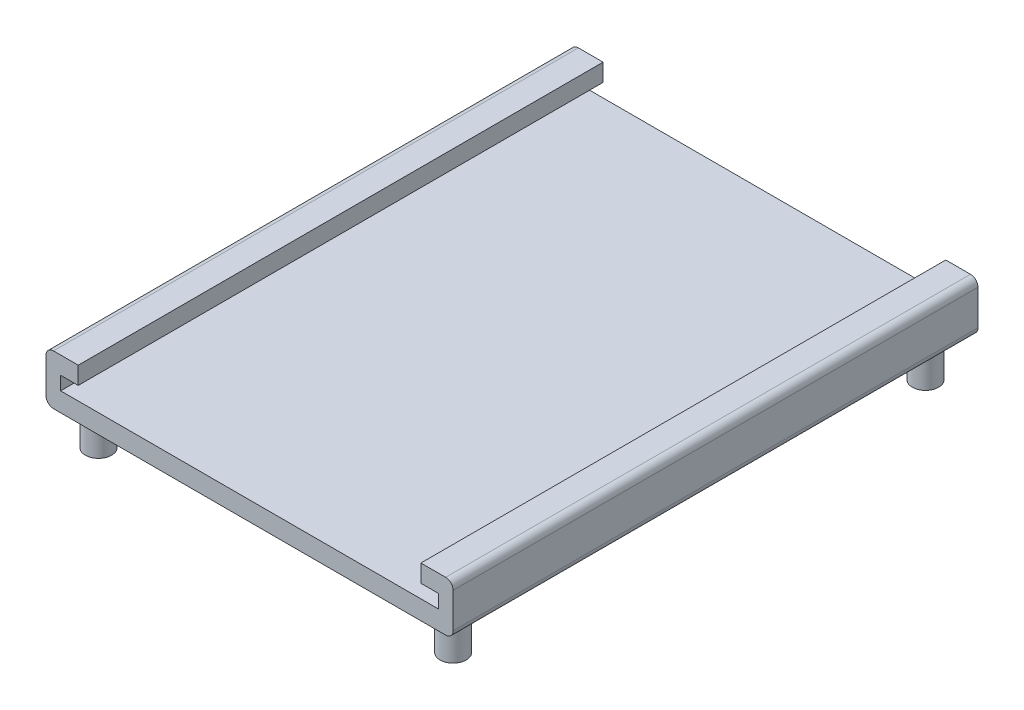
ISO-10303-21;
HEADER;
FILE_DESCRIPTION(('STEP AP214'),'2;1');
FILE_NAME('part.step','',(''),(''),'','','');
FILE_SCHEMA(('AUTOMOTIVE_DESIGN { 1 0 10303 214 1 1 1 1 }'));
ENDSEC;
DATA;
#1=APPLICATION_CONTEXT('core data for automotive mechanical design processes');
#2=APPLICATION_PROTOCOL_DEFINITION('international standard','automotive_design',2000,#1);
#3=PRODUCT_CONTEXT('',#1,'mechanical');
#4=PRODUCT('Part','Part','',(#3));
#5=PRODUCT_RELATED_PRODUCT_CATEGORY('part','',(#4));
#6=PRODUCT_DEFINITION_FORMATION('','',#4);
#7=PRODUCT_DEFINITION_CONTEXT('part definition',#1,'design');
#8=PRODUCT_DEFINITION('design','',#6,#7);
#9=PRODUCT_DEFINITION_SHAPE('','',#8);
#10=(LENGTH_UNIT() NAMED_UNIT(*) SI_UNIT(.MILLI.,.METRE.));
#11=(NAMED_UNIT(*) PLANE_ANGLE_UNIT() SI_UNIT($,.RADIAN.));
#12=(NAMED_UNIT(*) SI_UNIT($,.STERADIAN.) SOLID_ANGLE_UNIT());
#13=UNCERTAINTY_MEASURE_WITH_UNIT(LENGTH_MEASURE(1.E-05),#10,'distance_accuracy_value','');
#14=(GEOMETRIC_REPRESENTATION_CONTEXT(3) GLOBAL_UNCERTAINTY_ASSIGNED_CONTEXT((#13)) GLOBAL_UNIT_ASSIGNED_CONTEXT((#10,
#11,#12)) REPRESENTATION_CONTEXT('',''));
#15=CARTESIAN_POINT('',(0.,0.,0.));
#16=DIRECTION('',(0.,0.,1.));
#17=DIRECTION('',(1.,0.,0.));
#18=AXIS2_PLACEMENT_3D('',#15,#16,#17);
#19=CARTESIAN_POINT('',(700.180956215145,865.595910234927,1266.5722605881));
#20=DIRECTION('',(0.,0.,1.));
#21=DIRECTION('',(0.,-1.,0.));
#22=AXIS2_PLACEMENT_3D('',#19,#20,#21);
#23=PLANE('',#22);
#24=DIRECTION('',(0.,1.,0.));
#25=VECTOR('',#24,1.);
#26=CARTESIAN_POINT('',(648.030956215145,865.595910234927,1266.5722605881));
#27=LINE('',#26,#25);
#28=CARTESIAN_POINT('',(648.030956215145,866.595910234927,1266.5722605881));
#29=VERTEX_POINT('',#28);
#30=CARTESIAN_POINT('',(648.030956215145,871.275910234927,1266.5722605881));
#31=VERTEX_POINT('',#30);
#32=EDGE_CURVE('E221',#29,#31,#27,.T.);
#33=ORIENTED_EDGE('',*,*,#32,.T.);
#34=CARTESIAN_POINT('',(649.030956215145,871.275910234927,1266.5722605881));
#35=DIRECTION('',(0.,0.,1.));
#36=DIRECTION('',(0.,-1.,0.));
#37=AXIS2_PLACEMENT_3D('',#34,#35,#36);
#38=CIRCLE('',#37,1.);
#39=CARTESIAN_POINT('',(649.030956215145,872.275910234927,1266.5722605881));
#40=VERTEX_POINT('',#39);
#41=EDGE_CURVE('E289',#31,#40,#38,.F.);
#42=ORIENTED_EDGE('',*,*,#41,.T.);
#43=DIRECTION('',(1.,0.,0.));
#44=VECTOR('',#43,1.);
#45=CARTESIAN_POINT('',(650.180956215145,872.275910234927,1266.5722605881));
#46=LINE('',#45,#44);
#47=CARTESIAN_POINT('',(652.330956215145,872.275910234927,1266.5722605881));
#48=VERTEX_POINT('',#47);
#49=EDGE_CURVE('E226',#40,#48,#46,.T.);
#50=ORIENTED_EDGE('',*,*,#49,.T.);
#51=DIRECTION('',(0.,-1.,0.));
#52=VECTOR('',#51,1.);
#53=CARTESIAN_POINT('',(652.330956215145,872.275910234927,1266.5722605881));
#54=LINE('',#53,#52);
#55=CARTESIAN_POINT('',(652.330956215145,869.935910234927,1266.5722605881));
#56=VERTEX_POINT('',#55);
#57=EDGE_CURVE('E215',#48,#56,#54,.T.);
#58=ORIENTED_EDGE('',*,*,#57,.T.);
#59=DIRECTION('',(1.,0.,0.));
#60=VECTOR('',#59,1.);
#61=CARTESIAN_POINT('',(649.980956215145,869.935910234927,1266.5722605881));
#62=LINE('',#61,#60);
#63=CARTESIAN_POINT('',(649.980956215145,869.935910234927,1266.5722605881));
#64=VERTEX_POINT('',#63);
#65=EDGE_CURVE('E190',#64,#56,#62,.T.);
#66=ORIENTED_EDGE('',*,*,#65,.F.);
#67=DIRECTION('',(0.,1.,0.));
#68=VECTOR('',#67,1.);
#69=CARTESIAN_POINT('',(649.980956215145,868.135910234927,1266.5722605881));
#70=LINE('',#69,#68);
#71=CARTESIAN_POINT('',(649.980956215145,868.135910234927,1266.5722605881));
#72=VERTEX_POINT('',#71);
#73=EDGE_CURVE('E204',#72,#64,#70,.T.);
#74=ORIENTED_EDGE('',*,*,#73,.F.);
#75=DIRECTION('',(1.,0.,0.));
#76=VECTOR('',#75,1.);
#77=CARTESIAN_POINT('',(700.180956215145,868.135910234927,1266.5722605881));
#78=LINE('',#77,#76);
#79=CARTESIAN_POINT('',(700.380956215145,868.135910234927,1266.5722605881));
#80=VERTEX_POINT('',#79);
#81=EDGE_CURVE('E248',#72,#80,#78,.T.);
#82=ORIENTED_EDGE('',*,*,#81,.T.);
#83=DIRECTION('',(0.,-1.,0.));
#84=VECTOR('',#83,1.);
#85=CARTESIAN_POINT('',(700.380956215145,868.135910234927,1266.5722605881));
#86=LINE('',#85,#84);
#87=CARTESIAN_POINT('',(700.380956215145,869.935910234927,1266.5722605881));
#88=VERTEX_POINT('',#87);
#89=EDGE_CURVE('E183',#88,#80,#86,.T.);
#90=ORIENTED_EDGE('',*,*,#89,.F.);
#91=DIRECTION('',(1.,0.,0.));
#92=VECTOR('',#91,1.);
#93=CARTESIAN_POINT('',(700.380956215145,869.935910234927,1266.5722605881));
#94=LINE('',#93,#92);
#95=CARTESIAN_POINT('',(698.030956215145,869.935910234927,1266.5722605881));
#96=VERTEX_POINT('',#95);
#97=EDGE_CURVE('E164',#96,#88,#94,.T.);
#98=ORIENTED_EDGE('',*,*,#97,.F.);
#99=DIRECTION('',(0.,-1.,0.));
#100=VECTOR('',#99,1.);
#101=CARTESIAN_POINT('',(698.030956215145,872.275910234927,1266.5722605881));
#102=LINE('',#101,#100);
#103=CARTESIAN_POINT('',(698.030956215145,872.275910234927,1266.5722605881));
#104=VERTEX_POINT('',#103);
#105=EDGE_CURVE('E228',#104,#96,#102,.T.);
#106=ORIENTED_EDGE('',*,*,#105,.F.);
#107=DIRECTION('',(1.,0.,0.));
#108=VECTOR('',#107,1.);
#109=CARTESIAN_POINT('',(700.180956215145,872.275910234927,1266.5722605881));
#110=LINE('',#109,#108);
#111=CARTESIAN_POINT('',(701.330956215145,872.275910234927,1266.5722605881));
#112=VERTEX_POINT('',#111);
#113=EDGE_CURVE('E239',#104,#112,#110,.T.);
#114=ORIENTED_EDGE('',*,*,#113,.T.);
#115=CARTESIAN_POINT('',(701.330956215145,871.275910234927,1266.5722605881));
#116=DIRECTION('',(0.,0.,1.));
#117=DIRECTION('',(0.,-1.,0.));
#118=AXIS2_PLACEMENT_3D('',#115,#116,#117);
#119=CIRCLE('',#118,1.);
#120=CARTESIAN_POINT('',(702.330956215145,871.275910234927,1266.5722605881));
#121=VERTEX_POINT('',#120);
#122=EDGE_CURVE('E284',#112,#121,#119,.F.);
#123=ORIENTED_EDGE('',*,*,#122,.T.);
#124=DIRECTION('',(0.,-1.,0.));
#125=VECTOR('',#124,1.);
#126=CARTESIAN_POINT('',(702.330956215145,865.595910234927,1266.5722605881));
#127=LINE('',#126,#125);
#128=CARTESIAN_POINT('',(702.330956215145,866.595910234927,1266.5722605881));
#129=VERTEX_POINT('',#128);
#130=EDGE_CURVE('E242',#121,#129,#127,.T.);
#131=ORIENTED_EDGE('',*,*,#130,.T.);
#132=CARTESIAN_POINT('',(701.330956215145,866.595910234927,1266.5722605881));
#133=DIRECTION('',(0.,0.,1.));
#134=DIRECTION('',(0.,-1.,0.));
#135=AXIS2_PLACEMENT_3D('',#132,#133,#134);
#136=CIRCLE('',#135,1.);
#137=CARTESIAN_POINT('',(701.330956215145,865.595910234927,1266.5722605881));
#138=VERTEX_POINT('',#137);
#139=EDGE_CURVE('E59',#129,#138,#136,.F.);
#140=ORIENTED_EDGE('',*,*,#139,.T.);
#141=DIRECTION('',(1.,0.,0.));
#142=VECTOR('',#141,1.);
#143=CARTESIAN_POINT('',(700.180956215145,865.595910234927,1266.5722605881));
#144=LINE('',#143,#142);
#145=CARTESIAN_POINT('',(649.030956215145,865.595910234927,1266.5722605881));
#146=VERTEX_POINT('',#145);
#147=EDGE_CURVE('E249',#146,#138,#144,.T.);
#148=ORIENTED_EDGE('',*,*,#147,.F.);
#149=CARTESIAN_POINT('',(649.030956215145,866.595910234927,1266.5722605881));
#150=DIRECTION('',(0.,0.,1.));
#151=DIRECTION('',(0.,-1.,0.));
#152=AXIS2_PLACEMENT_3D('',#149,#150,#151);
#153=CIRCLE('',#152,1.);
#154=EDGE_CURVE('E287',#146,#29,#153,.F.);
#155=ORIENTED_EDGE('',*,*,#154,.T.);
#156=EDGE_LOOP('',(#33,#42,#50,#58,#66,#74,#82,#90,#98,#106,#114,#123,#131,#140,#148,#155));
#157=FACE_BOUND('',#156,.T.);
#158=ADVANCED_FACE('F44',(#157),#23,.F.);
#159=CARTESIAN_POINT('',(650.180956215145,865.595910234927,1336.5722605881));
#160=DIRECTION('',(0.,0.,-1.));
#161=DIRECTION('',(0.,1.,0.));
#162=AXIS2_PLACEMENT_3D('',#159,#160,#161);
#163=PLANE('',#162);
#164=DIRECTION('',(-1.,0.,0.));
#165=VECTOR('',#164,1.);
#166=CARTESIAN_POINT('',(650.180956215145,872.275910234927,1336.5722605881));
#167=LINE('',#166,#165);
#168=CARTESIAN_POINT('',(652.330956215145,872.275910234927,1336.5722605881));
#169=VERTEX_POINT('',#168);
#170=CARTESIAN_POINT('',(649.030956215145,872.275910234927,1336.5722605881));
#171=VERTEX_POINT('',#170);
#172=EDGE_CURVE('E225',#169,#171,#167,.T.);
#173=ORIENTED_EDGE('',*,*,#172,.T.);
#174=CARTESIAN_POINT('',(649.030956215145,871.275910234927,1336.5722605881));
#175=DIRECTION('',(0.,0.,-1.));
#176=DIRECTION('',(0.,1.,0.));
#177=AXIS2_PLACEMENT_3D('',#174,#175,#176);
#178=CIRCLE('',#177,1.);
#179=CARTESIAN_POINT('',(648.030956215145,871.275910234927,1336.5722605881));
#180=VERTEX_POINT('',#179);
#181=EDGE_CURVE('E277',#171,#180,#178,.F.);
#182=ORIENTED_EDGE('',*,*,#181,.T.);
#183=DIRECTION('',(0.,-1.,0.));
#184=VECTOR('',#183,1.);
#185=CARTESIAN_POINT('',(648.030956215145,865.595910234927,1336.5722605881));
#186=LINE('',#185,#184);
#187=CARTESIAN_POINT('',(648.030956215145,866.595910234927,1336.5722605881));
#188=VERTEX_POINT('',#187);
#189=EDGE_CURVE('E222',#180,#188,#186,.T.);
#190=ORIENTED_EDGE('',*,*,#189,.T.);
#191=CARTESIAN_POINT('',(649.030956215145,866.595910234927,1336.5722605881));
#192=DIRECTION('',(0.,0.,-1.));
#193=DIRECTION('',(0.,1.,0.));
#194=AXIS2_PLACEMENT_3D('',#191,#192,#193);
#195=CIRCLE('',#194,1.);
#196=CARTESIAN_POINT('',(649.030956215145,865.595910234927,1336.5722605881));
#197=VERTEX_POINT('',#196);
#198=EDGE_CURVE('E275',#188,#197,#195,.F.);
#199=ORIENTED_EDGE('',*,*,#198,.T.);
#200=DIRECTION('',(-1.,0.,0.));
#201=VECTOR('',#200,1.);
#202=CARTESIAN_POINT('',(650.180956215145,865.595910234927,1336.5722605881));
#203=LINE('',#202,#201);
#204=CARTESIAN_POINT('',(701.330956215145,865.595910234927,1336.5722605881));
#205=VERTEX_POINT('',#204);
#206=EDGE_CURVE('E251',#205,#197,#203,.T.);
#207=ORIENTED_EDGE('',*,*,#206,.F.);
#208=CARTESIAN_POINT('',(701.330956215145,866.595910234927,1336.5722605881));
#209=DIRECTION('',(0.,0.,-1.));
#210=DIRECTION('',(0.,1.,0.));
#211=AXIS2_PLACEMENT_3D('',#208,#209,#210);
#212=CIRCLE('',#211,1.);
#213=CARTESIAN_POINT('',(702.330956215145,866.595910234927,1336.5722605881));
#214=VERTEX_POINT('',#213);
#215=EDGE_CURVE('E273',#205,#214,#212,.F.);
#216=ORIENTED_EDGE('',*,*,#215,.T.);
#217=DIRECTION('',(0.,1.,0.));
#218=VECTOR('',#217,1.);
#219=CARTESIAN_POINT('',(702.330956215145,865.595910234927,1336.5722605881));
#220=LINE('',#219,#218);
#221=CARTESIAN_POINT('',(702.330956215145,871.275910234927,1336.5722605881));
#222=VERTEX_POINT('',#221);
#223=EDGE_CURVE('E238',#214,#222,#220,.T.);
#224=ORIENTED_EDGE('',*,*,#223,.T.);
#225=CARTESIAN_POINT('',(701.330956215145,871.275910234927,1336.5722605881));
#226=DIRECTION('',(0.,0.,-1.));
#227=DIRECTION('',(0.,1.,0.));
#228=AXIS2_PLACEMENT_3D('',#225,#226,#227);
#229=CIRCLE('',#228,1.);
#230=CARTESIAN_POINT('',(701.330956215145,872.275910234927,1336.5722605881));
#231=VERTEX_POINT('',#230);
#232=EDGE_CURVE('E271',#222,#231,#229,.F.);
#233=ORIENTED_EDGE('',*,*,#232,.T.);
#234=DIRECTION('',(-1.,0.,0.));
#235=VECTOR('',#234,1.);
#236=CARTESIAN_POINT('',(700.180956215145,872.275910234927,1336.5722605881));
#237=LINE('',#236,#235);
#238=CARTESIAN_POINT('',(698.030956215145,872.275910234927,1336.5722605881));
#239=VERTEX_POINT('',#238);
#240=EDGE_CURVE('E243',#231,#239,#237,.T.);
#241=ORIENTED_EDGE('',*,*,#240,.T.);
#242=DIRECTION('',(0.,-1.,0.));
#243=VECTOR('',#242,1.);
#244=CARTESIAN_POINT('',(698.030956215145,872.275910234927,1336.5722605881));
#245=LINE('',#244,#243);
#246=CARTESIAN_POINT('',(698.030956215145,869.935910234927,1336.5722605881));
#247=VERTEX_POINT('',#246);
#248=EDGE_CURVE('E182',#239,#247,#245,.T.);
#249=ORIENTED_EDGE('',*,*,#248,.T.);
#250=DIRECTION('',(1.,0.,0.));
#251=VECTOR('',#250,1.);
#252=CARTESIAN_POINT('',(700.380956215145,869.935910234927,1336.5722605881));
#253=LINE('',#252,#251);
#254=CARTESIAN_POINT('',(700.380956215145,869.935910234927,1336.5722605881));
#255=VERTEX_POINT('',#254);
#256=EDGE_CURVE('E161',#247,#255,#253,.T.);
#257=ORIENTED_EDGE('',*,*,#256,.T.);
#258=DIRECTION('',(0.,-1.,0.));
#259=VECTOR('',#258,1.);
#260=CARTESIAN_POINT('',(700.380956215145,868.135910234927,1336.5722605881));
#261=LINE('',#260,#259);
#262=CARTESIAN_POINT('',(700.380956215145,868.135910234927,1336.5722605881));
#263=VERTEX_POINT('',#262);
#264=EDGE_CURVE('E173',#255,#263,#261,.T.);
#265=ORIENTED_EDGE('',*,*,#264,.T.);
#266=DIRECTION('',(-1.,0.,0.));
#267=VECTOR('',#266,1.);
#268=CARTESIAN_POINT('',(650.180956215145,868.135910234927,1336.5722605881));
#269=LINE('',#268,#267);
#270=CARTESIAN_POINT('',(649.980956215145,868.135910234927,1336.5722605881));
#271=VERTEX_POINT('',#270);
#272=EDGE_CURVE('E252',#263,#271,#269,.T.);
#273=ORIENTED_EDGE('',*,*,#272,.T.);
#274=DIRECTION('',(0.,1.,0.));
#275=VECTOR('',#274,1.);
#276=CARTESIAN_POINT('',(649.980956215145,868.135910234927,1336.5722605881));
#277=LINE('',#276,#275);
#278=CARTESIAN_POINT('',(649.980956215145,869.935910234927,1336.5722605881));
#279=VERTEX_POINT('',#278);
#280=EDGE_CURVE('E198',#271,#279,#277,.T.);
#281=ORIENTED_EDGE('',*,*,#280,.T.);
#282=DIRECTION('',(1.,0.,0.));
#283=VECTOR('',#282,1.);
#284=CARTESIAN_POINT('',(649.980956215145,869.935910234927,1336.5722605881));
#285=LINE('',#284,#283);
#286=CARTESIAN_POINT('',(652.330956215145,869.935910234927,1336.5722605881));
#287=VERTEX_POINT('',#286);
#288=EDGE_CURVE('E207',#279,#287,#285,.T.);
#289=ORIENTED_EDGE('',*,*,#288,.T.);
#290=DIRECTION('',(0.,-1.,0.));
#291=VECTOR('',#290,1.);
#292=CARTESIAN_POINT('',(652.330956215145,872.275910234927,1336.5722605881));
#293=LINE('',#292,#291);
#294=EDGE_CURVE('E218',#169,#287,#293,.T.);
#295=ORIENTED_EDGE('',*,*,#294,.F.);
#296=EDGE_LOOP('',(#173,#182,#190,#199,#207,#216,#224,#233,#241,#249,#257,#265,#273,#281,#289,#295));
#297=FACE_BOUND('',#296,.T.);
#298=ADVANCED_FACE('F180',(#297),#163,.F.);
#299=CARTESIAN_POINT('',(-3.84642954158624E-12,865.59591023492,-2.74491585467571E-12));
#300=DIRECTION('',(0.,1.,0.));
#301=DIRECTION('',(-1.,0.,0.));
#302=AXIS2_PLACEMENT_3D('',#299,#300,#301);
#303=PLANE('',#302);
#304=CARTESIAN_POINT('',(651.530956215145,865.595910234927,1270.0722605881));
#305=DIRECTION('',(0.,1.,0.));
#306=DIRECTION('',(-1.,0.,0.));
#307=AXIS2_PLACEMENT_3D('',#304,#305,#306);
#308=CIRCLE('',#307,1.74999999999997);
#309=CARTESIAN_POINT('',(649.780956215145,865.595910234927,1270.0722605881));
#310=VERTEX_POINT('',#309);
#311=EDGE_CURVE('E265',#310,#310,#308,.F.);
#312=ORIENTED_EDGE('',*,*,#311,.F.);
#313=EDGE_LOOP('',(#312));
#314=FACE_BOUND('',#313,.T.);
#315=CARTESIAN_POINT('',(698.830956215145,865.595910234927,1270.0722605881));
#316=DIRECTION('',(0.,1.,0.));
#317=DIRECTION('',(-1.,0.,0.));
#318=AXIS2_PLACEMENT_3D('',#315,#316,#317);
#319=CIRCLE('',#318,1.74999999999997);
#320=CARTESIAN_POINT('',(697.080956215145,865.595910234927,1270.0722605881));
#321=VERTEX_POINT('',#320);
#322=EDGE_CURVE('E262',#321,#321,#319,.F.);
#323=ORIENTED_EDGE('',*,*,#322,.F.);
#324=EDGE_LOOP('',(#323));
#325=FACE_BOUND('',#324,.T.);
#326=CARTESIAN_POINT('',(698.830956215145,865.595910234927,1333.0722605881));
#327=DIRECTION('',(0.,1.,0.));
#328=DIRECTION('',(-1.,0.,0.));
#329=AXIS2_PLACEMENT_3D('',#326,#327,#328);
#330=CIRCLE('',#329,1.74999999999997);
#331=CARTESIAN_POINT('',(697.080956215145,865.595910234927,1333.0722605881));
#332=VERTEX_POINT('',#331);
#333=EDGE_CURVE('E259',#332,#332,#330,.F.);
#334=ORIENTED_EDGE('',*,*,#333,.F.);
#335=EDGE_LOOP('',(#334));
#336=FACE_BOUND('',#335,.T.);
#337=CARTESIAN_POINT('',(651.530956215145,865.595910234927,1333.0722605881));
#338=DIRECTION('',(0.,1.,0.));
#339=DIRECTION('',(-1.,0.,0.));
#340=AXIS2_PLACEMENT_3D('',#337,#338,#339);
#341=CIRCLE('',#340,1.74999999999997);
#342=CARTESIAN_POINT('',(649.780956215145,865.595910234927,1333.0722605881));
#343=VERTEX_POINT('',#342);
#344=EDGE_CURVE('E254',#343,#343,#341,.F.);
#345=ORIENTED_EDGE('',*,*,#344,.F.);
#346=EDGE_LOOP('',(#345));
#347=FACE_BOUND('',#346,.T.);
#348=ORIENTED_EDGE('',*,*,#206,.T.);
#349=DIRECTION('',(0.,0.,1.));
#350=VECTOR('',#349,1.);
#351=CARTESIAN_POINT('',(649.030956215145,865.595910234927,1266.5722605881));
#352=LINE('',#351,#350);
#353=EDGE_CURVE('E66',#197,#146,#352,.F.);
#354=ORIENTED_EDGE('',*,*,#353,.T.);
#355=ORIENTED_EDGE('',*,*,#147,.T.);
#356=DIRECTION('',(0.,0.,1.));
#357=VECTOR('',#356,1.);
#358=CARTESIAN_POINT('',(701.330956215145,865.595910234927,1336.5722605881));
#359=LINE('',#358,#357);
#360=EDGE_CURVE('E291',#138,#205,#359,.T.);
#361=ORIENTED_EDGE('',*,*,#360,.T.);
#362=EDGE_LOOP('',(#348,#354,#355,#361));
#363=FACE_BOUND('',#362,.T.);
#364=ADVANCED_FACE('F308',(#314,#325,#336,#347,#363),#303,.F.);
#365=CARTESIAN_POINT('',(-3.8552979041869E-12,868.13591023492,-2.75378421727637E-12));
#366=DIRECTION('',(0.,1.,0.));
#367=DIRECTION('',(-1.,0.,0.));
#368=AXIS2_PLACEMENT_3D('',#365,#366,#367);
#369=PLANE('',#368);
#370=DIRECTION('',(0.,0.,-1.));
#371=VECTOR('',#370,1.);
#372=CARTESIAN_POINT('',(649.980956215145,868.135910234927,1336.5722605881));
#373=LINE('',#372,#371);
#374=EDGE_CURVE('E199',#271,#72,#373,.T.);
#375=ORIENTED_EDGE('',*,*,#374,.F.);
#376=ORIENTED_EDGE('',*,*,#272,.F.);
#377=DIRECTION('',(0.,0.,-1.));
#378=VECTOR('',#377,1.);
#379=CARTESIAN_POINT('',(700.380956215145,868.135910234927,1336.5722605881));
#380=LINE('',#379,#378);
#381=EDGE_CURVE('E168',#263,#80,#380,.T.);
#382=ORIENTED_EDGE('',*,*,#381,.T.);
#383=ORIENTED_EDGE('',*,*,#81,.F.);
#384=EDGE_LOOP('',(#375,#376,#382,#383));
#385=FACE_BOUND('',#384,.T.);
#386=ADVANCED_FACE('F340',(#385),#369,.T.);
#387=CARTESIAN_POINT('',(700.180956215145,872.275910234927,1259.55478953365));
#388=DIRECTION('',(0.,1.,0.));
#389=DIRECTION('',(0.,0.,1.));
#390=AXIS2_PLACEMENT_3D('',#387,#388,#389);
#391=PLANE('',#390);
#392=ORIENTED_EDGE('',*,*,#240,.F.);
#393=DIRECTION('',(0.,0.,1.));
#394=VECTOR('',#393,1.);
#395=CARTESIAN_POINT('',(701.330956215145,872.275910234927,1259.55478953365));
#396=LINE('',#395,#394);
#397=EDGE_CURVE('E11',#231,#112,#396,.F.);
#398=ORIENTED_EDGE('',*,*,#397,.T.);
#399=ORIENTED_EDGE('',*,*,#113,.F.);
#400=DIRECTION('',(0.,0.,1.));
#401=VECTOR('',#400,1.);
#402=CARTESIAN_POINT('',(698.030956215145,872.275910234927,1266.5722605881));
#403=LINE('',#402,#401);
#404=EDGE_CURVE('E235',#104,#239,#403,.T.);
#405=ORIENTED_EDGE('',*,*,#404,.T.);
#406=EDGE_LOOP('',(#392,#398,#399,#405));
#407=FACE_BOUND('',#406,.T.);
#408=ADVANCED_FACE('F347',(#407),#391,.T.);
#409=CARTESIAN_POINT('',(702.330956215145,865.595910234927,1259.55478953365));
#410=DIRECTION('',(1.,0.,0.));
#411=DIRECTION('',(0.,0.,-1.));
#412=AXIS2_PLACEMENT_3D('',#409,#410,#411);
#413=PLANE('',#412);
#414=ORIENTED_EDGE('',*,*,#223,.F.);
#415=DIRECTION('',(0.,0.,1.));
#416=VECTOR('',#415,1.);
#417=CARTESIAN_POINT('',(702.330956215145,866.595910234927,1266.5722605881));
#418=LINE('',#417,#416);
#419=EDGE_CURVE('E52',#214,#129,#418,.F.);
#420=ORIENTED_EDGE('',*,*,#419,.T.);
#421=ORIENTED_EDGE('',*,*,#130,.F.);
#422=DIRECTION('',(0.,0.,1.));
#423=VECTOR('',#422,1.);
#424=CARTESIAN_POINT('',(702.330956215145,871.275910234927,1259.55478953365));
#425=LINE('',#424,#423);
#426=EDGE_CURVE('E295',#121,#222,#425,.T.);
#427=ORIENTED_EDGE('',*,*,#426,.T.);
#428=EDGE_LOOP('',(#414,#420,#421,#427));
#429=FACE_BOUND('',#428,.T.);
#430=ADVANCED_FACE('F301',(#429),#413,.T.);
#431=CARTESIAN_POINT('',(698.030956215145,872.275910234927,1266.5722605881));
#432=DIRECTION('',(1.,0.,0.));
#433=DIRECTION('',(0.,1.,0.));
#434=AXIS2_PLACEMENT_3D('',#431,#432,#433);
#435=PLANE('',#434);
#436=ORIENTED_EDGE('',*,*,#105,.T.);
#437=DIRECTION('',(0.,0.,-1.));
#438=VECTOR('',#437,1.);
#439=CARTESIAN_POINT('',(698.030956215145,869.935910234927,1336.5722605881));
#440=LINE('',#439,#438);
#441=EDGE_CURVE('E169',#247,#96,#440,.T.);
#442=ORIENTED_EDGE('',*,*,#441,.F.);
#443=ORIENTED_EDGE('',*,*,#248,.F.);
#444=ORIENTED_EDGE('',*,*,#404,.F.);
#445=EDGE_LOOP('',(#436,#442,#443,#444));
#446=FACE_BOUND('',#445,.T.);
#447=ADVANCED_FACE('F344',(#446),#435,.F.);
#448=CARTESIAN_POINT('',(648.030956215145,865.595910234927,1259.55478953365));
#449=DIRECTION('',(-1.,0.,0.));
#450=DIRECTION('',(0.,0.,1.));
#451=AXIS2_PLACEMENT_3D('',#448,#449,#450);
#452=PLANE('',#451);
#453=ORIENTED_EDGE('',*,*,#189,.F.);
#454=DIRECTION('',(0.,0.,1.));
#455=VECTOR('',#454,1.);
#456=CARTESIAN_POINT('',(648.030956215145,871.275910234927,1259.55478953365));
#457=LINE('',#456,#455);
#458=EDGE_CURVE('E282',#180,#31,#457,.F.);
#459=ORIENTED_EDGE('',*,*,#458,.T.);
#460=ORIENTED_EDGE('',*,*,#32,.F.);
#461=DIRECTION('',(0.,0.,1.));
#462=VECTOR('',#461,1.);
#463=CARTESIAN_POINT('',(648.030956215145,866.595910234927,1336.5722605881));
#464=LINE('',#463,#462);
#465=EDGE_CURVE('E279',#29,#188,#464,.T.);
#466=ORIENTED_EDGE('',*,*,#465,.T.);
#467=EDGE_LOOP('',(#453,#459,#460,#466));
#468=FACE_BOUND('',#467,.T.);
#469=ADVANCED_FACE('F316',(#468),#452,.T.);
#470=CARTESIAN_POINT('',(650.180956215145,872.275910234927,1259.55478953365));
#471=DIRECTION('',(0.,1.,0.));
#472=DIRECTION('',(0.,0.,1.));
#473=AXIS2_PLACEMENT_3D('',#470,#471,#472);
#474=PLANE('',#473);
#475=ORIENTED_EDGE('',*,*,#49,.F.);
#476=DIRECTION('',(0.,0.,1.));
#477=VECTOR('',#476,1.);
#478=CARTESIAN_POINT('',(649.030956215145,872.275910234927,1259.55478953365));
#479=LINE('',#478,#477);
#480=EDGE_CURVE('E268',#40,#171,#479,.T.);
#481=ORIENTED_EDGE('',*,*,#480,.T.);
#482=ORIENTED_EDGE('',*,*,#172,.F.);
#483=DIRECTION('',(0.,0.,-1.));
#484=VECTOR('',#483,1.);
#485=CARTESIAN_POINT('',(652.330956215145,872.275910234927,1266.5722605881));
#486=LINE('',#485,#484);
#487=EDGE_CURVE('E192',#169,#48,#486,.T.);
#488=ORIENTED_EDGE('',*,*,#487,.T.);
#489=EDGE_LOOP('',(#475,#481,#482,#488));
#490=FACE_BOUND('',#489,.T.);
#491=ADVANCED_FACE('F324',(#490),#474,.T.);
#492=CARTESIAN_POINT('',(652.330956215145,872.275910234927,1266.5722605881));
#493=DIRECTION('',(-1.,0.,0.));
#494=DIRECTION('',(0.,-1.,0.));
#495=AXIS2_PLACEMENT_3D('',#492,#493,#494);
#496=PLANE('',#495);
#497=ORIENTED_EDGE('',*,*,#294,.T.);
#498=DIRECTION('',(0.,0.,-1.));
#499=VECTOR('',#498,1.);
#500=CARTESIAN_POINT('',(652.330956215145,869.935910234927,1336.5722605881));
#501=LINE('',#500,#499);
#502=EDGE_CURVE('E195',#287,#56,#501,.T.);
#503=ORIENTED_EDGE('',*,*,#502,.T.);
#504=ORIENTED_EDGE('',*,*,#57,.F.);
#505=ORIENTED_EDGE('',*,*,#487,.F.);
#506=EDGE_LOOP('',(#497,#503,#504,#505));
#507=FACE_BOUND('',#506,.T.);
#508=ADVANCED_FACE('F330',(#507),#496,.F.);
#509=CARTESIAN_POINT('',(649.980956215145,869.935910234927,1336.5722605881));
#510=DIRECTION('',(0.,1.,0.));
#511=DIRECTION('',(0.,0.,1.));
#512=AXIS2_PLACEMENT_3D('',#509,#510,#511);
#513=PLANE('',#512);
#514=ORIENTED_EDGE('',*,*,#65,.T.);
#515=ORIENTED_EDGE('',*,*,#502,.F.);
#516=ORIENTED_EDGE('',*,*,#288,.F.);
#517=DIRECTION('',(0.,0.,-1.));
#518=VECTOR('',#517,1.);
#519=CARTESIAN_POINT('',(649.980956215145,869.935910234927,1336.5722605881));
#520=LINE('',#519,#518);
#521=EDGE_CURVE('E202',#279,#64,#520,.T.);
#522=ORIENTED_EDGE('',*,*,#521,.T.);
#523=EDGE_LOOP('',(#514,#515,#516,#522));
#524=FACE_BOUND('',#523,.T.);
#525=ADVANCED_FACE('F334',(#524),#513,.F.);
#526=CARTESIAN_POINT('',(649.980956215145,868.135910234927,1336.5722605881));
#527=DIRECTION('',(-1.,0.,0.));
#528=DIRECTION('',(0.,0.,1.));
#529=AXIS2_PLACEMENT_3D('',#526,#527,#528);
#530=PLANE('',#529);
#531=ORIENTED_EDGE('',*,*,#73,.T.);
#532=ORIENTED_EDGE('',*,*,#521,.F.);
#533=ORIENTED_EDGE('',*,*,#280,.F.);
#534=ORIENTED_EDGE('',*,*,#374,.T.);
#535=EDGE_LOOP('',(#531,#532,#533,#534));
#536=FACE_BOUND('',#535,.T.);
#537=ADVANCED_FACE('F337',(#536),#530,.F.);
#538=CARTESIAN_POINT('',(700.380956215145,868.135910234927,1336.5722605881));
#539=DIRECTION('',(1.,0.,0.));
#540=DIRECTION('',(0.,0.,-1.));
#541=AXIS2_PLACEMENT_3D('',#538,#539,#540);
#542=PLANE('',#541);
#543=ORIENTED_EDGE('',*,*,#89,.T.);
#544=ORIENTED_EDGE('',*,*,#381,.F.);
#545=ORIENTED_EDGE('',*,*,#264,.F.);
#546=DIRECTION('',(0.,0.,-1.));
#547=VECTOR('',#546,1.);
#548=CARTESIAN_POINT('',(700.380956215145,869.935910234927,1336.5722605881));
#549=LINE('',#548,#547);
#550=EDGE_CURVE('E157',#255,#88,#549,.T.);
#551=ORIENTED_EDGE('',*,*,#550,.T.);
#552=EDGE_LOOP('',(#543,#544,#545,#551));
#553=FACE_BOUND('',#552,.T.);
#554=ADVANCED_FACE('F174',(#553),#542,.F.);
#555=CARTESIAN_POINT('',(700.380956215145,869.935910234927,1336.5722605881));
#556=DIRECTION('',(0.,1.,0.));
#557=DIRECTION('',(0.,0.,1.));
#558=AXIS2_PLACEMENT_3D('',#555,#556,#557);
#559=PLANE('',#558);
#560=ORIENTED_EDGE('',*,*,#97,.T.);
#561=ORIENTED_EDGE('',*,*,#550,.F.);
#562=ORIENTED_EDGE('',*,*,#256,.F.);
#563=ORIENTED_EDGE('',*,*,#441,.T.);
#564=EDGE_LOOP('',(#560,#561,#562,#563));
#565=FACE_BOUND('',#564,.T.);
#566=ADVANCED_FACE('F159',(#565),#559,.F.);
#567=CARTESIAN_POINT('',(651.530956215145,860.595910234927,1333.0722605881));
#568=DIRECTION('',(0.,1.,0.));
#569=DIRECTION('',(-1.,0.,0.));
#570=AXIS2_PLACEMENT_3D('',#567,#568,#569);
#571=CYLINDRICAL_SURFACE('',#570,1.74999999999997);
#572=CARTESIAN_POINT('',(651.530956215145,860.595910234927,1333.0722605881));
#573=DIRECTION('',(0.,-1.,0.));
#574=DIRECTION('',(1.,0.,0.));
#575=AXIS2_PLACEMENT_3D('',#572,#573,#574);
#576=CIRCLE('',#575,1.74999999999997);
#577=CARTESIAN_POINT('',(653.280956215145,860.595910234927,1333.0722605881));
#578=VERTEX_POINT('',#577);
#579=EDGE_CURVE('E187',#578,#578,#576,.T.);
#580=ORIENTED_EDGE('',*,*,#579,.F.);
#581=EDGE_LOOP('',(#580));
#582=FACE_BOUND('',#581,.T.);
#583=ORIENTED_EDGE('',*,*,#344,.T.);
#584=EDGE_LOOP('',(#583));
#585=FACE_BOUND('',#584,.T.);
#586=ADVANCED_FACE('F448',(#582,#585),#571,.T.);
#587=CARTESIAN_POINT('',(651.530956215145,860.595910234927,1333.0722605881));
#588=DIRECTION('',(0.,-1.,0.));
#589=DIRECTION('',(1.,0.,0.));
#590=AXIS2_PLACEMENT_3D('',#587,#588,#589);
#591=PLANE('',#590);
#592=ORIENTED_EDGE('',*,*,#579,.T.);
#593=EDGE_LOOP('',(#592));
#594=FACE_BOUND('',#593,.T.);
#595=ADVANCED_FACE('F439',(#594),#591,.T.);
#596=CARTESIAN_POINT('',(698.830956215145,860.595910234927,1333.0722605881));
#597=DIRECTION('',(0.,1.,0.));
#598=DIRECTION('',(-1.,0.,0.));
#599=AXIS2_PLACEMENT_3D('',#596,#597,#598);
#600=CYLINDRICAL_SURFACE('',#599,1.74999999999997);
#601=CARTESIAN_POINT('',(698.830956215145,860.595910234927,1333.0722605881));
#602=DIRECTION('',(0.,-1.,0.));
#603=DIRECTION('',(-1.,0.,0.));
#604=AXIS2_PLACEMENT_3D('',#601,#602,#603);
#605=CIRCLE('',#604,1.74999999999997);
#606=CARTESIAN_POINT('',(697.080956215145,860.595910234927,1333.0722605881));
#607=VERTEX_POINT('',#606);
#608=EDGE_CURVE('E628',#607,#607,#605,.T.);
#609=ORIENTED_EDGE('',*,*,#608,.F.);
#610=EDGE_LOOP('',(#609));
#611=FACE_BOUND('',#610,.T.);
#612=ORIENTED_EDGE('',*,*,#333,.T.);
#613=EDGE_LOOP('',(#612));
#614=FACE_BOUND('',#613,.T.);
#615=ADVANCED_FACE('F430',(#611,#614),#600,.T.);
#616=CARTESIAN_POINT('',(698.830956215145,860.595910234927,1333.0722605881));
#617=DIRECTION('',(0.,1.,0.));
#618=DIRECTION('',(-1.,0.,0.));
#619=AXIS2_PLACEMENT_3D('',#616,#617,#618);
#620=PLANE('',#619);
#621=ORIENTED_EDGE('',*,*,#608,.T.);
#622=EDGE_LOOP('',(#621));
#623=FACE_BOUND('',#622,.T.);
#624=ADVANCED_FACE('F421',(#623),#620,.F.);
#625=CARTESIAN_POINT('',(698.830956215145,860.595910234927,1270.0722605881));
#626=DIRECTION('',(0.,1.,0.));
#627=DIRECTION('',(-1.,0.,0.));
#628=AXIS2_PLACEMENT_3D('',#625,#626,#627);
#629=CYLINDRICAL_SURFACE('',#628,1.74999999999997);
#630=CARTESIAN_POINT('',(698.830956215145,860.595910234927,1270.0722605881));
#631=DIRECTION('',(0.,-1.,0.));
#632=DIRECTION('',(1.,0.,0.));
#633=AXIS2_PLACEMENT_3D('',#630,#631,#632);
#634=CIRCLE('',#633,1.74999999999997);
#635=CARTESIAN_POINT('',(700.580956215145,860.595910234927,1270.0722605881));
#636=VERTEX_POINT('',#635);
#637=EDGE_CURVE('E630',#636,#636,#634,.T.);
#638=ORIENTED_EDGE('',*,*,#637,.F.);
#639=EDGE_LOOP('',(#638));
#640=FACE_BOUND('',#639,.T.);
#641=ORIENTED_EDGE('',*,*,#322,.T.);
#642=EDGE_LOOP('',(#641));
#643=FACE_BOUND('',#642,.T.);
#644=ADVANCED_FACE('F412',(#640,#643),#629,.T.);
#645=CARTESIAN_POINT('',(698.830956215145,860.595910234927,1270.0722605881));
#646=DIRECTION('',(0.,-1.,0.));
#647=DIRECTION('',(1.,0.,0.));
#648=AXIS2_PLACEMENT_3D('',#645,#646,#647);
#649=PLANE('',#648);
#650=ORIENTED_EDGE('',*,*,#637,.T.);
#651=EDGE_LOOP('',(#650));
#652=FACE_BOUND('',#651,.T.);
#653=ADVANCED_FACE('F403',(#652),#649,.T.);
#654=CARTESIAN_POINT('',(651.530956215145,860.595910234927,1270.0722605881));
#655=DIRECTION('',(0.,1.,0.));
#656=DIRECTION('',(-1.,0.,0.));
#657=AXIS2_PLACEMENT_3D('',#654,#655,#656);
#658=CYLINDRICAL_SURFACE('',#657,1.74999999999997);
#659=CARTESIAN_POINT('',(651.530956215145,860.595910234927,1270.0722605881));
#660=DIRECTION('',(0.,-1.,0.));
#661=DIRECTION('',(-1.,0.,0.));
#662=AXIS2_PLACEMENT_3D('',#659,#660,#661);
#663=CIRCLE('',#662,1.74999999999997);
#664=CARTESIAN_POINT('',(649.780956215145,860.595910234927,1270.0722605881));
#665=VERTEX_POINT('',#664);
#666=EDGE_CURVE('E634',#665,#665,#663,.T.);
#667=ORIENTED_EDGE('',*,*,#666,.F.);
#668=EDGE_LOOP('',(#667));
#669=FACE_BOUND('',#668,.T.);
#670=ORIENTED_EDGE('',*,*,#311,.T.);
#671=EDGE_LOOP('',(#670));
#672=FACE_BOUND('',#671,.T.);
#673=ADVANCED_FACE('F394',(#669,#672),#658,.T.);
#674=CARTESIAN_POINT('',(651.530956215145,860.595910234927,1270.0722605881));
#675=DIRECTION('',(0.,1.,0.));
#676=DIRECTION('',(-1.,0.,0.));
#677=AXIS2_PLACEMENT_3D('',#674,#675,#676);
#678=PLANE('',#677);
#679=ORIENTED_EDGE('',*,*,#666,.T.);
#680=EDGE_LOOP('',(#679));
#681=FACE_BOUND('',#680,.T.);
#682=ADVANCED_FACE('F365',(#681),#678,.F.);
#683=CARTESIAN_POINT('',(649.030956215145,871.275910234927,1259.55478953365));
#684=DIRECTION('',(0.,0.,1.));
#685=DIRECTION('',(1.,0.,0.));
#686=AXIS2_PLACEMENT_3D('',#683,#684,#685);
#687=CYLINDRICAL_SURFACE('',#686,1.);
#688=ORIENTED_EDGE('',*,*,#41,.F.);
#689=ORIENTED_EDGE('',*,*,#458,.F.);
#690=ORIENTED_EDGE('',*,*,#181,.F.);
#691=ORIENTED_EDGE('',*,*,#480,.F.);
#692=EDGE_LOOP('',(#688,#689,#690,#691));
#693=FACE_BOUND('',#692,.T.);
#694=ADVANCED_FACE('F322',(#693),#687,.T.);
#695=CARTESIAN_POINT('',(649.030956215145,866.595910234927,1259.55478953365));
#696=DIRECTION('',(0.,0.,-1.));
#697=DIRECTION('',(0.,1.,0.));
#698=AXIS2_PLACEMENT_3D('',#695,#696,#697);
#699=CYLINDRICAL_SURFACE('',#698,1.);
#700=ORIENTED_EDGE('',*,*,#154,.F.);
#701=ORIENTED_EDGE('',*,*,#353,.F.);
#702=ORIENTED_EDGE('',*,*,#198,.F.);
#703=ORIENTED_EDGE('',*,*,#465,.F.);
#704=EDGE_LOOP('',(#700,#701,#702,#703));
#705=FACE_BOUND('',#704,.T.);
#706=ADVANCED_FACE('F313',(#705),#699,.T.);
#707=CARTESIAN_POINT('',(701.330956215145,866.595910234923,-2.74808792046036E-12));
#708=DIRECTION('',(0.,0.,-1.));
#709=DIRECTION('',(0.,1.,0.));
#710=AXIS2_PLACEMENT_3D('',#707,#708,#709);
#711=CYLINDRICAL_SURFACE('',#710,1.);
#712=ORIENTED_EDGE('',*,*,#139,.F.);
#713=ORIENTED_EDGE('',*,*,#419,.F.);
#714=ORIENTED_EDGE('',*,*,#215,.F.);
#715=ORIENTED_EDGE('',*,*,#360,.F.);
#716=EDGE_LOOP('',(#712,#713,#714,#715));
#717=FACE_BOUND('',#716,.T.);
#718=ADVANCED_FACE('F306',(#717),#711,.T.);
#719=CARTESIAN_POINT('',(701.330956215145,871.275910234927,1259.55478953365));
#720=DIRECTION('',(0.,0.,1.));
#721=DIRECTION('',(1.,0.,0.));
#722=AXIS2_PLACEMENT_3D('',#719,#720,#721);
#723=CYLINDRICAL_SURFACE('',#722,1.);
#724=ORIENTED_EDGE('',*,*,#122,.F.);
#725=ORIENTED_EDGE('',*,*,#397,.F.);
#726=ORIENTED_EDGE('',*,*,#232,.F.);
#727=ORIENTED_EDGE('',*,*,#426,.F.);
#728=EDGE_LOOP('',(#724,#725,#726,#727));
#729=FACE_BOUND('',#728,.T.);
#730=ADVANCED_FACE('F46',(#729),#723,.T.);
#731=CLOSED_SHELL('',(#158,#298,#364,#386,#408,#430,#447,#469,#491,#508,#525,#537,#554,#566,
#586,#595,#615,#624,#644,#653,#673,#682,#694,#706,#718,#730));
#732=MANIFOLD_SOLID_BREP('B2',#731);
#733=ADVANCED_BREP_SHAPE_REPRESENTATION('',(#18,#732),#14);
#734=SHAPE_DEFINITION_REPRESENTATION(#9,#733);
ENDSEC;
END-ISO-10303-21;
